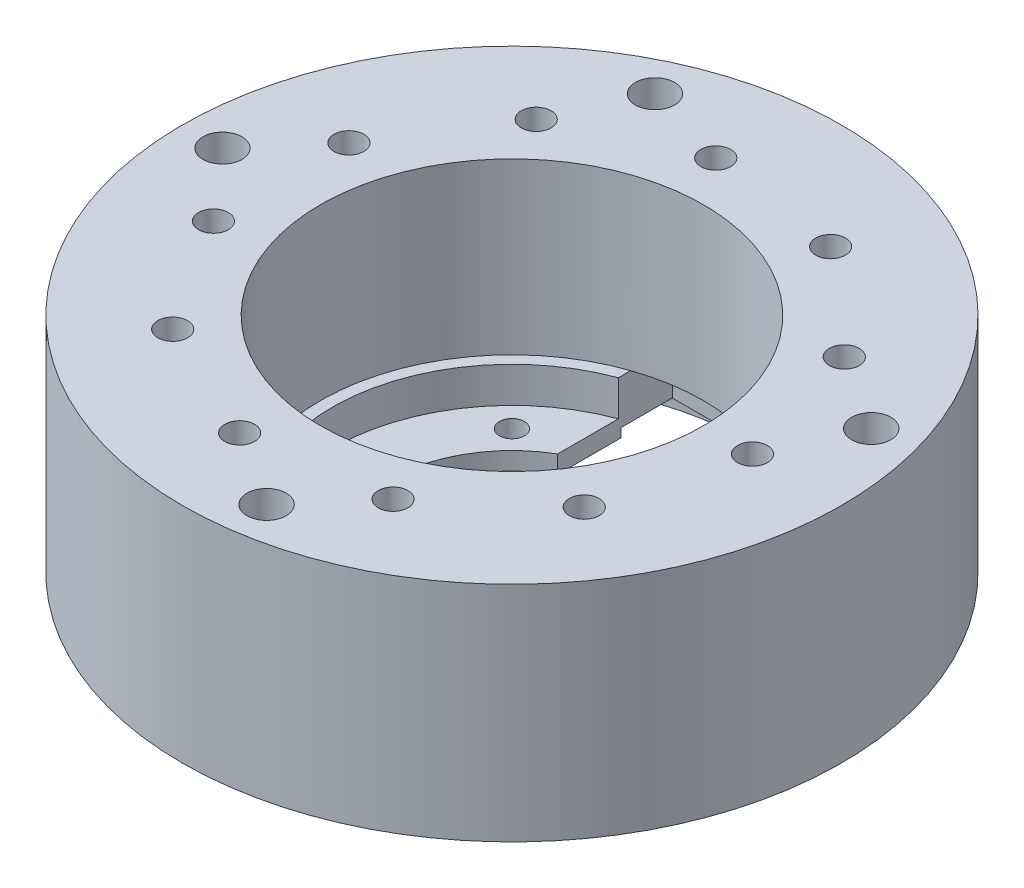
ISO-10303-21;
HEADER;
FILE_DESCRIPTION(('STEP AP214'),'2;1');
FILE_NAME('part.step','',(''),(''),'','','');
FILE_SCHEMA(('AUTOMOTIVE_DESIGN { 1 0 10303 214 1 1 1 1 }'));
ENDSEC;
DATA;
#1=APPLICATION_CONTEXT('core data for automotive mechanical design processes');
#2=APPLICATION_PROTOCOL_DEFINITION('international standard','automotive_design',2000,#1);
#3=PRODUCT_CONTEXT('',#1,'mechanical');
#4=PRODUCT('Part','Part','',(#3));
#5=PRODUCT_RELATED_PRODUCT_CATEGORY('part','',(#4));
#6=PRODUCT_DEFINITION_FORMATION('','',#4);
#7=PRODUCT_DEFINITION_CONTEXT('part definition',#1,'design');
#8=PRODUCT_DEFINITION('design','',#6,#7);
#9=PRODUCT_DEFINITION_SHAPE('','',#8);
#10=(LENGTH_UNIT() NAMED_UNIT(*) SI_UNIT(.MILLI.,.METRE.));
#11=(NAMED_UNIT(*) PLANE_ANGLE_UNIT() SI_UNIT($,.RADIAN.));
#12=(NAMED_UNIT(*) SI_UNIT($,.STERADIAN.) SOLID_ANGLE_UNIT());
#13=UNCERTAINTY_MEASURE_WITH_UNIT(LENGTH_MEASURE(1.E-05),#10,'distance_accuracy_value','');
#14=(GEOMETRIC_REPRESENTATION_CONTEXT(3) GLOBAL_UNCERTAINTY_ASSIGNED_CONTEXT((#13)) GLOBAL_UNIT_ASSIGNED_CONTEXT((#10,
#11,#12)) REPRESENTATION_CONTEXT('',''));
#15=CARTESIAN_POINT('',(0.,0.,0.));
#16=DIRECTION('',(0.,0.,1.));
#17=DIRECTION('',(1.,0.,0.));
#18=AXIS2_PLACEMENT_3D('',#15,#16,#17);
#19=CARTESIAN_POINT('',(0.,0.,0.));
#20=DIRECTION('',(0.,1.,0.));
#21=DIRECTION('',(0.,0.,1.));
#22=AXIS2_PLACEMENT_3D('',#19,#20,#21);
#23=PLANE('',#22);
#24=CARTESIAN_POINT('',(0.,0.,0.));
#25=DIRECTION('',(0.,1.,0.));
#26=DIRECTION('',(0.,0.,1.));
#27=AXIS2_PLACEMENT_3D('',#24,#25,#26);
#28=CIRCLE('',#27,20.5);
#29=CARTESIAN_POINT('',(-7.,0.,-19.2678488679977));
#30=VERTEX_POINT('',#29);
#31=CARTESIAN_POINT('',(7.,0.,-19.2678488679977));
#32=VERTEX_POINT('',#31);
#33=EDGE_CURVE('E109',#30,#32,#28,.T.);
#34=ORIENTED_EDGE('',*,*,#33,.F.);
#35=DIRECTION('',(0.,0.,1.));
#36=VECTOR('',#35,1.);
#37=CARTESIAN_POINT('',(-7.,0.,-11.));
#38=LINE('',#37,#36);
#39=CARTESIAN_POINT('',(-7.,0.,-12.1243556529821));
#40=VERTEX_POINT('',#39);
#41=EDGE_CURVE('E135',#30,#40,#38,.T.);
#42=ORIENTED_EDGE('',*,*,#41,.T.);
#43=CARTESIAN_POINT('',(0.,0.,0.));
#44=DIRECTION('',(0.,1.,0.));
#45=DIRECTION('',(0.,0.,1.));
#46=AXIS2_PLACEMENT_3D('',#43,#44,#45);
#47=CIRCLE('',#46,14.);
#48=CARTESIAN_POINT('',(7.,0.,-12.1243556529821));
#49=VERTEX_POINT('',#48);
#50=EDGE_CURVE('E131',#40,#49,#47,.T.);
#51=ORIENTED_EDGE('',*,*,#50,.T.);
#52=DIRECTION('',(0.,0.,-1.));
#53=VECTOR('',#52,1.);
#54=CARTESIAN_POINT('',(7.,0.,-11.));
#55=LINE('',#54,#53);
#56=EDGE_CURVE('E124',#49,#32,#55,.T.);
#57=ORIENTED_EDGE('',*,*,#56,.T.);
#58=EDGE_LOOP('',(#34,#42,#51,#57));
#59=FACE_BOUND('',#58,.T.);
#60=CARTESIAN_POINT('',(12.021,0.,-12.021));
#61=DIRECTION('',(0.,1.,0.));
#62=DIRECTION('',(0.,0.,1.));
#63=AXIS2_PLACEMENT_3D('',#60,#61,#62);
#64=CIRCLE('',#63,1.4);
#65=CARTESIAN_POINT('',(12.021,0.,-10.621));
#66=VERTEX_POINT('',#65);
#67=EDGE_CURVE('E212',#66,#66,#64,.T.);
#68=ORIENTED_EDGE('',*,*,#67,.T.);
#69=EDGE_LOOP('',(#68));
#70=FACE_BOUND('',#69,.T.);
#71=CARTESIAN_POINT('',(12.021,0.,12.021));
#72=DIRECTION('',(0.,1.,0.));
#73=DIRECTION('',(0.,0.,1.));
#74=AXIS2_PLACEMENT_3D('',#71,#72,#73);
#75=CIRCLE('',#74,1.4);
#76=CARTESIAN_POINT('',(12.021,0.,13.421));
#77=VERTEX_POINT('',#76);
#78=EDGE_CURVE('E211',#77,#77,#75,.T.);
#79=ORIENTED_EDGE('',*,*,#78,.T.);
#80=EDGE_LOOP('',(#79));
#81=FACE_BOUND('',#80,.T.);
#82=CARTESIAN_POINT('',(-12.0210000000001,0.,12.0209999999999));
#83=DIRECTION('',(0.,1.,0.));
#84=DIRECTION('',(0.,0.,1.));
#85=AXIS2_PLACEMENT_3D('',#82,#83,#84);
#86=CIRCLE('',#85,1.4);
#87=CARTESIAN_POINT('',(-12.0210000000001,0.,13.4209999999999));
#88=VERTEX_POINT('',#87);
#89=EDGE_CURVE('E218',#88,#88,#86,.T.);
#90=ORIENTED_EDGE('',*,*,#89,.T.);
#91=EDGE_LOOP('',(#90));
#92=FACE_BOUND('',#91,.T.);
#93=CARTESIAN_POINT('',(-12.0209999999999,0.,-12.0210000000001));
#94=DIRECTION('',(0.,1.,0.));
#95=DIRECTION('',(0.,0.,1.));
#96=AXIS2_PLACEMENT_3D('',#93,#94,#95);
#97=CIRCLE('',#96,1.4);
#98=CARTESIAN_POINT('',(-12.0209999999999,0.,-10.6210000000001));
#99=VERTEX_POINT('',#98);
#100=EDGE_CURVE('E213',#99,#99,#97,.T.);
#101=ORIENTED_EDGE('',*,*,#100,.T.);
#102=EDGE_LOOP('',(#101));
#103=FACE_BOUND('',#102,.T.);
#104=ADVANCED_FACE('F39',(#59,#70,#81,#92,#103),#23,.F.);
#105=CARTESIAN_POINT('',(0.,2.,0.));
#106=DIRECTION('',(0.,1.,0.));
#107=DIRECTION('',(0.,0.,1.));
#108=AXIS2_PLACEMENT_3D('',#105,#106,#107);
#109=CYLINDRICAL_SURFACE('',#108,20.2);
#110=DIRECTION('',(0.,1.,0.));
#111=VECTOR('',#110,1.);
#112=CARTESIAN_POINT('',(7.,2.,-18.9483508517232));
#113=LINE('',#112,#111);
#114=CARTESIAN_POINT('',(7.,2.,-18.9483508517232));
#115=VERTEX_POINT('',#114);
#116=CARTESIAN_POINT('',(7.,6.,-18.9483508517232));
#117=VERTEX_POINT('',#116);
#118=EDGE_CURVE('E154',#115,#117,#113,.T.);
#119=ORIENTED_EDGE('',*,*,#118,.F.);
#120=CARTESIAN_POINT('',(0.,2.,0.));
#121=DIRECTION('',(0.,1.,0.));
#122=DIRECTION('',(0.,0.,1.));
#123=AXIS2_PLACEMENT_3D('',#120,#121,#122);
#124=CIRCLE('',#123,20.2);
#125=CARTESIAN_POINT('',(-7.,2.,-18.9483508517232));
#126=VERTEX_POINT('',#125);
#127=EDGE_CURVE('E162',#126,#115,#124,.T.);
#128=ORIENTED_EDGE('',*,*,#127,.F.);
#129=DIRECTION('',(0.,1.,0.));
#130=VECTOR('',#129,1.);
#131=CARTESIAN_POINT('',(-7.,2.,-18.9483508517232));
#132=LINE('',#131,#130);
#133=CARTESIAN_POINT('',(-7.,6.,-18.9483508517232));
#134=VERTEX_POINT('',#133);
#135=EDGE_CURVE('E148',#134,#126,#132,.F.);
#136=ORIENTED_EDGE('',*,*,#135,.F.);
#137=CARTESIAN_POINT('',(0.,6.,0.));
#138=DIRECTION('',(0.,1.,0.));
#139=DIRECTION('',(0.,0.,1.));
#140=AXIS2_PLACEMENT_3D('',#137,#138,#139);
#141=CIRCLE('',#140,20.2);
#142=EDGE_CURVE('E159',#134,#117,#141,.T.);
#143=ORIENTED_EDGE('',*,*,#142,.T.);
#144=EDGE_LOOP('',(#119,#128,#136,#143));
#145=FACE_BOUND('',#144,.T.);
#146=ADVANCED_FACE('F337',(#145),#109,.F.);
#147=CARTESIAN_POINT('',(0.,2.,0.));
#148=DIRECTION('',(0.,1.,0.));
#149=DIRECTION('',(0.,0.,1.));
#150=AXIS2_PLACEMENT_3D('',#147,#148,#149);
#151=PLANE('',#150);
#152=CARTESIAN_POINT('',(-12.0209999999999,2.,-12.0210000000001));
#153=DIRECTION('',(0.,1.,0.));
#154=DIRECTION('',(0.,0.,1.));
#155=AXIS2_PLACEMENT_3D('',#152,#153,#154);
#156=CIRCLE('',#155,1.4);
#157=CARTESIAN_POINT('',(-12.0209999999999,2.,-10.6210000000001));
#158=VERTEX_POINT('',#157);
#159=EDGE_CURVE('E133',#158,#158,#156,.F.);
#160=ORIENTED_EDGE('',*,*,#159,.T.);
#161=EDGE_LOOP('',(#160));
#162=FACE_BOUND('',#161,.T.);
#163=CARTESIAN_POINT('',(-12.0210000000001,2.,12.0209999999999));
#164=DIRECTION('',(0.,1.,0.));
#165=DIRECTION('',(0.,0.,1.));
#166=AXIS2_PLACEMENT_3D('',#163,#164,#165);
#167=CIRCLE('',#166,1.4);
#168=CARTESIAN_POINT('',(-12.0210000000001,2.,13.4209999999999));
#169=VERTEX_POINT('',#168);
#170=EDGE_CURVE('E136',#169,#169,#167,.F.);
#171=ORIENTED_EDGE('',*,*,#170,.T.);
#172=EDGE_LOOP('',(#171));
#173=FACE_BOUND('',#172,.T.);
#174=CARTESIAN_POINT('',(12.021,2.,12.021));
#175=DIRECTION('',(0.,1.,0.));
#176=DIRECTION('',(0.,0.,1.));
#177=AXIS2_PLACEMENT_3D('',#174,#175,#176);
#178=CIRCLE('',#177,1.4);
#179=CARTESIAN_POINT('',(12.021,2.,13.421));
#180=VERTEX_POINT('',#179);
#181=EDGE_CURVE('E202',#180,#180,#178,.F.);
#182=ORIENTED_EDGE('',*,*,#181,.T.);
#183=EDGE_LOOP('',(#182));
#184=FACE_BOUND('',#183,.T.);
#185=CARTESIAN_POINT('',(12.021,2.,-12.021));
#186=DIRECTION('',(0.,1.,0.));
#187=DIRECTION('',(0.,0.,1.));
#188=AXIS2_PLACEMENT_3D('',#185,#186,#187);
#189=CIRCLE('',#188,1.4);
#190=CARTESIAN_POINT('',(12.021,2.,-10.621));
#191=VERTEX_POINT('',#190);
#192=EDGE_CURVE('E206',#191,#191,#189,.F.);
#193=ORIENTED_EDGE('',*,*,#192,.T.);
#194=EDGE_LOOP('',(#193));
#195=FACE_BOUND('',#194,.T.);
#196=ORIENTED_EDGE('',*,*,#127,.T.);
#197=DIRECTION('',(0.,0.,1.));
#198=VECTOR('',#197,1.);
#199=CARTESIAN_POINT('',(7.00000000000001,2.,0.));
#200=LINE('',#199,#198);
#201=CARTESIAN_POINT('',(7.,2.,-12.1243556529821));
#202=VERTEX_POINT('',#201);
#203=EDGE_CURVE('E155',#115,#202,#200,.T.);
#204=ORIENTED_EDGE('',*,*,#203,.T.);
#205=CARTESIAN_POINT('',(0.,2.,0.));
#206=DIRECTION('',(0.,1.,0.));
#207=DIRECTION('',(0.,0.,1.));
#208=AXIS2_PLACEMENT_3D('',#205,#206,#207);
#209=CIRCLE('',#208,14.);
#210=CARTESIAN_POINT('',(-7.,2.,-12.1243556529821));
#211=VERTEX_POINT('',#210);
#212=EDGE_CURVE('E160',#211,#202,#209,.T.);
#213=ORIENTED_EDGE('',*,*,#212,.F.);
#214=DIRECTION('',(0.,0.,-1.));
#215=VECTOR('',#214,1.);
#216=CARTESIAN_POINT('',(-6.99999999999999,2.,0.));
#217=LINE('',#216,#215);
#218=EDGE_CURVE('E65',#211,#126,#217,.T.);
#219=ORIENTED_EDGE('',*,*,#218,.T.);
#220=EDGE_LOOP('',(#196,#204,#213,#219));
#221=FACE_BOUND('',#220,.T.);
#222=ADVANCED_FACE('F345',(#162,#173,#184,#195,#221),#151,.T.);
#223=CARTESIAN_POINT('',(0.,0.,0.));
#224=DIRECTION('',(0.,1.,0.));
#225=DIRECTION('',(0.,0.,1.));
#226=AXIS2_PLACEMENT_3D('',#223,#224,#225);
#227=CYLINDRICAL_SURFACE('',#226,14.);
#228=DIRECTION('',(0.,1.,0.));
#229=VECTOR('',#228,1.);
#230=CARTESIAN_POINT('',(7.,0.,-12.1243556529821));
#231=LINE('',#230,#229);
#232=EDGE_CURVE('E181',#49,#202,#231,.T.);
#233=ORIENTED_EDGE('',*,*,#232,.F.);
#234=ORIENTED_EDGE('',*,*,#50,.F.);
#235=DIRECTION('',(0.,1.,0.));
#236=VECTOR('',#235,1.);
#237=CARTESIAN_POINT('',(-7.,0.,-12.1243556529821));
#238=LINE('',#237,#236);
#239=EDGE_CURVE('E180',#211,#40,#238,.F.);
#240=ORIENTED_EDGE('',*,*,#239,.F.);
#241=ORIENTED_EDGE('',*,*,#212,.T.);
#242=EDGE_LOOP('',(#233,#234,#240,#241));
#243=FACE_BOUND('',#242,.T.);
#244=ADVANCED_FACE('F361',(#243),#227,.F.);
#245=CARTESIAN_POINT('',(0.,25.05,0.));
#246=DIRECTION('',(0.,-1.,0.));
#247=DIRECTION('',(0.,0.,-1.));
#248=AXIS2_PLACEMENT_3D('',#245,#246,#247);
#249=CYLINDRICAL_SURFACE('',#248,37.);
#250=CARTESIAN_POINT('',(0.,25.05,0.));
#251=DIRECTION('',(0.,1.,0.));
#252=DIRECTION('',(0.,0.,1.));
#253=AXIS2_PLACEMENT_3D('',#250,#251,#252);
#254=CIRCLE('',#253,37.);
#255=CARTESIAN_POINT('',(0.,25.05,37.));
#256=VERTEX_POINT('',#255);
#257=EDGE_CURVE('E172',#256,#256,#254,.T.);
#258=ORIENTED_EDGE('',*,*,#257,.F.);
#259=EDGE_LOOP('',(#258));
#260=FACE_BOUND('',#259,.T.);
#261=CARTESIAN_POINT('',(0.,0.,0.));
#262=DIRECTION('',(0.,1.,0.));
#263=DIRECTION('',(0.,0.,1.));
#264=AXIS2_PLACEMENT_3D('',#261,#262,#263);
#265=CIRCLE('',#264,37.);
#266=CARTESIAN_POINT('',(0.,0.,37.));
#267=VERTEX_POINT('',#266);
#268=EDGE_CURVE('E167',#267,#267,#265,.T.);
#269=ORIENTED_EDGE('',*,*,#268,.T.);
#270=EDGE_LOOP('',(#269));
#271=FACE_BOUND('',#270,.T.);
#272=ADVANCED_FACE('F41',(#260,#271),#249,.T.);
#273=CARTESIAN_POINT('',(0.,25.05,0.));
#274=DIRECTION('',(0.,1.,0.));
#275=DIRECTION('',(0.,0.,1.));
#276=AXIS2_PLACEMENT_3D('',#273,#274,#275);
#277=PLANE('',#276);
#278=CARTESIAN_POINT('',(31.1841026986622,25.05,-9.15432896936147));
#279=DIRECTION('',(0.,1.,0.));
#280=DIRECTION('',(0.,0.,1.));
#281=AXIS2_PLACEMENT_3D('',#278,#279,#280);
#282=CIRCLE('',#281,2.2);
#283=CARTESIAN_POINT('',(31.1841026986622,25.05,-6.95432896936147));
#284=VERTEX_POINT('',#283);
#285=EDGE_CURVE('E310',#284,#284,#282,.T.);
#286=ORIENTED_EDGE('',*,*,#285,.F.);
#287=EDGE_LOOP('',(#286));
#288=FACE_BOUND('',#287,.T.);
#289=CARTESIAN_POINT('',(-13.5033332090834,25.05,-29.5619686801212));
#290=DIRECTION('',(0.,1.,0.));
#291=DIRECTION('',(0.,0.,1.));
#292=AXIS2_PLACEMENT_3D('',#289,#290,#291);
#293=CIRCLE('',#292,2.2);
#294=CARTESIAN_POINT('',(-13.5033332090834,25.05,-27.3619686801212));
#295=VERTEX_POINT('',#294);
#296=EDGE_CURVE('E302',#295,#295,#293,.T.);
#297=ORIENTED_EDGE('',*,*,#296,.F.);
#298=EDGE_LOOP('',(#297));
#299=FACE_BOUND('',#298,.T.);
#300=CARTESIAN_POINT('',(-32.5,25.05,2.34906491219261E-13));
#301=DIRECTION('',(0.,1.,0.));
#302=DIRECTION('',(0.,0.,1.));
#303=AXIS2_PLACEMENT_3D('',#300,#301,#302);
#304=CIRCLE('',#303,2.2);
#305=CARTESIAN_POINT('',(-32.5,25.05,2.20000000000024));
#306=VERTEX_POINT('',#305);
#307=EDGE_CURVE('E296',#306,#306,#304,.T.);
#308=ORIENTED_EDGE('',*,*,#307,.F.);
#309=EDGE_LOOP('',(#308));
#310=FACE_BOUND('',#309,.T.);
#311=CARTESIAN_POINT('',(4.62421140809311,25.05,32.1693436186264));
#312=DIRECTION('',(0.,1.,0.));
#313=DIRECTION('',(0.,0.,1.));
#314=AXIS2_PLACEMENT_3D('',#311,#312,#313);
#315=CIRCLE('',#314,2.2);
#316=CARTESIAN_POINT('',(4.62421140809311,25.05,34.3693436186264));
#317=VERTEX_POINT('',#316);
#318=EDGE_CURVE('E292',#317,#317,#315,.T.);
#319=ORIENTED_EDGE('',*,*,#318,.F.);
#320=EDGE_LOOP('',(#319));
#321=FACE_BOUND('',#320,.T.);
#322=CARTESIAN_POINT('',(27.,25.05,0.));
#323=DIRECTION('',(0.,1.,0.));
#324=DIRECTION('',(0.,0.,1.));
#325=AXIS2_PLACEMENT_3D('',#322,#323,#324);
#326=CIRCLE('',#325,1.675);
#327=CARTESIAN_POINT('',(27.,25.05,1.675));
#328=VERTEX_POINT('',#327);
#329=EDGE_CURVE('E271',#328,#328,#326,.T.);
#330=ORIENTED_EDGE('',*,*,#329,.F.);
#331=EDGE_LOOP('',(#330));
#332=FACE_BOUND('',#331,.T.);
#333=CARTESIAN_POINT('',(22.7138453864421,25.05,-14.5973020713008));
#334=DIRECTION('',(0.,1.,0.));
#335=DIRECTION('',(0.,0.,1.));
#336=AXIS2_PLACEMENT_3D('',#333,#334,#335);
#337=CIRCLE('',#336,1.675);
#338=CARTESIAN_POINT('',(22.7138453864421,25.05,-12.9223020713008));
#339=VERTEX_POINT('',#338);
#340=EDGE_CURVE('E280',#339,#339,#337,.T.);
#341=ORIENTED_EDGE('',*,*,#340,.F.);
#342=EDGE_LOOP('',(#341));
#343=FACE_BOUND('',#342,.T.);
#344=CARTESIAN_POINT('',(11.2162053510512,25.05,-24.5600638745719));
#345=DIRECTION('',(0.,1.,0.));
#346=DIRECTION('',(0.,0.,1.));
#347=AXIS2_PLACEMENT_3D('',#344,#345,#346);
#348=CIRCLE('',#347,1.675);
#349=CARTESIAN_POINT('',(11.2162053510512,25.05,-22.8850638745719));
#350=VERTEX_POINT('',#349);
#351=EDGE_CURVE('E226',#350,#350,#348,.T.);
#352=ORIENTED_EDGE('',*,*,#351,.F.);
#353=EDGE_LOOP('',(#352));
#354=FACE_BOUND('',#353,.T.);
#355=CARTESIAN_POINT('',(-3.84250063337842,25.05,-26.7251789307852));
#356=DIRECTION('',(0.,1.,0.));
#357=DIRECTION('',(0.,0.,1.));
#358=AXIS2_PLACEMENT_3D('',#355,#356,#357);
#359=CIRCLE('',#358,1.675);
#360=CARTESIAN_POINT('',(-3.84250063337842,25.05,-25.0501789307852));
#361=VERTEX_POINT('',#360);
#362=EDGE_CURVE('E227',#361,#361,#359,.T.);
#363=ORIENTED_EDGE('',*,*,#362,.F.);
#364=EDGE_LOOP('',(#363));
#365=FACE_BOUND('',#364,.T.);
#366=CARTESIAN_POINT('',(-17.6812398165225,25.05,-20.4052385075651));
#367=DIRECTION('',(0.,1.,0.));
#368=DIRECTION('',(0.,0.,1.));
#369=AXIS2_PLACEMENT_3D('',#366,#367,#368);
#370=CIRCLE('',#369,1.675);
#371=CARTESIAN_POINT('',(-17.6812398165225,25.05,-18.7302385075651));
#372=VERTEX_POINT('',#371);
#373=EDGE_CURVE('E234',#372,#372,#370,.T.);
#374=ORIENTED_EDGE('',*,*,#373,.F.);
#375=EDGE_LOOP('',(#374));
#376=FACE_BOUND('',#375,.T.);
#377=CARTESIAN_POINT('',(-25.9063102875914,25.05,-7.6067790347188));
#378=DIRECTION('',(0.,1.,0.));
#379=DIRECTION('',(0.,0.,1.));
#380=AXIS2_PLACEMENT_3D('',#377,#378,#379);
#381=CIRCLE('',#380,1.675);
#382=CARTESIAN_POINT('',(-25.9063102875914,25.05,-5.9317790347188));
#383=VERTEX_POINT('',#382);
#384=EDGE_CURVE('E239',#383,#383,#381,.T.);
#385=ORIENTED_EDGE('',*,*,#384,.F.);
#386=EDGE_LOOP('',(#385));
#387=FACE_BOUND('',#386,.T.);
#388=CARTESIAN_POINT('',(-25.9063102875915,25.05,7.60677903471843));
#389=DIRECTION('',(0.,1.,0.));
#390=DIRECTION('',(0.,0.,1.));
#391=AXIS2_PLACEMENT_3D('',#388,#389,#390);
#392=CIRCLE('',#391,1.675);
#393=CARTESIAN_POINT('',(-25.9063102875915,25.05,9.28177903471843));
#394=VERTEX_POINT('',#393);
#395=EDGE_CURVE('E246',#394,#394,#392,.T.);
#396=ORIENTED_EDGE('',*,*,#395,.F.);
#397=EDGE_LOOP('',(#396));
#398=FACE_BOUND('',#397,.T.);
#399=CARTESIAN_POINT('',(-17.6812398165228,25.05,20.4052385075649));
#400=DIRECTION('',(0.,1.,0.));
#401=DIRECTION('',(0.,0.,1.));
#402=AXIS2_PLACEMENT_3D('',#399,#400,#401);
#403=CIRCLE('',#402,1.675);
#404=CARTESIAN_POINT('',(-17.6812398165228,25.05,22.0802385075649));
#405=VERTEX_POINT('',#404);
#406=EDGE_CURVE('E255',#405,#405,#403,.T.);
#407=ORIENTED_EDGE('',*,*,#406,.F.);
#408=EDGE_LOOP('',(#407));
#409=FACE_BOUND('',#408,.T.);
#410=CARTESIAN_POINT('',(-3.8425006333788,25.05,26.7251789307852));
#411=DIRECTION('',(0.,1.,0.));
#412=DIRECTION('',(0.,0.,1.));
#413=AXIS2_PLACEMENT_3D('',#410,#411,#412);
#414=CIRCLE('',#413,1.675);
#415=CARTESIAN_POINT('',(-3.8425006333788,25.05,28.4001789307852));
#416=VERTEX_POINT('',#415);
#417=EDGE_CURVE('E259',#416,#416,#414,.T.);
#418=ORIENTED_EDGE('',*,*,#417,.F.);
#419=EDGE_LOOP('',(#418));
#420=FACE_BOUND('',#419,.T.);
#421=CARTESIAN_POINT('',(11.2162053510509,25.05,24.560063874572));
#422=DIRECTION('',(0.,1.,0.));
#423=DIRECTION('',(0.,0.,1.));
#424=AXIS2_PLACEMENT_3D('',#421,#422,#423);
#425=CIRCLE('',#424,1.675);
#426=CARTESIAN_POINT('',(11.2162053510509,25.05,26.235063874572));
#427=VERTEX_POINT('',#426);
#428=EDGE_CURVE('E262',#427,#427,#425,.T.);
#429=ORIENTED_EDGE('',*,*,#428,.F.);
#430=EDGE_LOOP('',(#429));
#431=FACE_BOUND('',#430,.T.);
#432=CARTESIAN_POINT('',(22.7138453864419,25.05,14.5973020713012));
#433=DIRECTION('',(0.,1.,0.));
#434=DIRECTION('',(0.,0.,1.));
#435=AXIS2_PLACEMENT_3D('',#432,#433,#434);
#436=CIRCLE('',#435,1.675);
#437=CARTESIAN_POINT('',(22.7138453864419,25.05,16.2723020713012));
#438=VERTEX_POINT('',#437);
#439=EDGE_CURVE('E267',#438,#438,#436,.T.);
#440=ORIENTED_EDGE('',*,*,#439,.F.);
#441=EDGE_LOOP('',(#440));
#442=FACE_BOUND('',#441,.T.);
#443=CARTESIAN_POINT('',(0.,25.05,0.));
#444=DIRECTION('',(0.,1.,0.));
#445=DIRECTION('',(0.,0.,1.));
#446=AXIS2_PLACEMENT_3D('',#443,#444,#445);
#447=CIRCLE('',#446,21.5);
#448=CARTESIAN_POINT('',(0.,25.05,21.5));
#449=VERTEX_POINT('',#448);
#450=EDGE_CURVE('E164',#449,#449,#447,.T.);
#451=ORIENTED_EDGE('',*,*,#450,.F.);
#452=EDGE_LOOP('',(#451));
#453=FACE_BOUND('',#452,.T.);
#454=ORIENTED_EDGE('',*,*,#257,.T.);
#455=EDGE_LOOP('',(#454));
#456=FACE_BOUND('',#455,.T.);
#457=ADVANCED_FACE('F350',(#288,#299,#310,#321,#332,#343,#354,#365,#376,#387,#398,#409,#420,
#431,#442,#453,#456),#277,.T.);
#458=CARTESIAN_POINT('',(0.,0.,0.));
#459=DIRECTION('',(0.,1.,0.));
#460=DIRECTION('',(0.,0.,1.));
#461=AXIS2_PLACEMENT_3D('',#458,#459,#460);
#462=CIRCLE('',#461,26.);
#463=CARTESIAN_POINT('',(0.,0.,26.));
#464=VERTEX_POINT('',#463);
#465=EDGE_CURVE('E312',#464,#464,#462,.T.);
#466=ORIENTED_EDGE('',*,*,#465,.T.);
#467=EDGE_LOOP('',(#466));
#468=FACE_BOUND('',#467,.T.);
#469=ORIENTED_EDGE('',*,*,#268,.F.);
#470=EDGE_LOOP('',(#469));
#471=FACE_BOUND('',#470,.T.);
#472=ADVANCED_FACE('F340',(#468,#471),#23,.F.);
#473=CARTESIAN_POINT('',(0.,6.,0.));
#474=DIRECTION('',(0.,1.,0.));
#475=DIRECTION('',(0.,0.,1.));
#476=AXIS2_PLACEMENT_3D('',#473,#474,#475);
#477=CYLINDRICAL_SURFACE('',#476,21.5);
#478=CARTESIAN_POINT('',(0.,6.,0.));
#479=DIRECTION('',(0.,1.,0.));
#480=DIRECTION('',(0.,0.,1.));
#481=AXIS2_PLACEMENT_3D('',#478,#479,#480);
#482=CIRCLE('',#481,21.5);
#483=CARTESIAN_POINT('',(7.,6.,-20.3285513502561));
#484=VERTEX_POINT('',#483);
#485=CARTESIAN_POINT('',(-7.,6.,-20.3285513502561));
#486=VERTEX_POINT('',#485);
#487=EDGE_CURVE('E166',#484,#486,#482,.T.);
#488=ORIENTED_EDGE('',*,*,#487,.F.);
#489=EDGE_CURVE('E171',#486,#484,#482,.T.);
#490=ORIENTED_EDGE('',*,*,#489,.F.);
#491=EDGE_LOOP('',(#488,#490));
#492=FACE_BOUND('',#491,.T.);
#493=ORIENTED_EDGE('',*,*,#450,.T.);
#494=EDGE_LOOP('',(#493));
#495=FACE_BOUND('',#494,.T.);
#496=ADVANCED_FACE('F346',(#492,#495),#477,.F.);
#497=CARTESIAN_POINT('',(0.,6.,0.));
#498=DIRECTION('',(0.,1.,0.));
#499=DIRECTION('',(0.,0.,1.));
#500=AXIS2_PLACEMENT_3D('',#497,#498,#499);
#501=PLANE('',#500);
#502=DIRECTION('',(0.,0.,-1.));
#503=VECTOR('',#502,1.);
#504=CARTESIAN_POINT('',(7.,6.,-11.));
#505=LINE('',#504,#503);
#506=EDGE_CURVE('E197',#117,#484,#505,.T.);
#507=ORIENTED_EDGE('',*,*,#506,.F.);
#508=ORIENTED_EDGE('',*,*,#142,.F.);
#509=DIRECTION('',(0.,0.,1.));
#510=VECTOR('',#509,1.);
#511=CARTESIAN_POINT('',(-7.,6.,-11.));
#512=LINE('',#511,#510);
#513=EDGE_CURVE('E198',#486,#134,#512,.T.);
#514=ORIENTED_EDGE('',*,*,#513,.F.);
#515=ORIENTED_EDGE('',*,*,#489,.T.);
#516=EDGE_LOOP('',(#507,#508,#514,#515));
#517=FACE_BOUND('',#516,.T.);
#518=ADVANCED_FACE('F351',(#517),#501,.T.);
#519=CARTESIAN_POINT('',(0.,6.,0.));
#520=DIRECTION('',(0.,-1.,0.));
#521=DIRECTION('',(0.,0.,-1.));
#522=AXIS2_PLACEMENT_3D('',#519,#520,#521);
#523=PLANE('',#522);
#524=ORIENTED_EDGE('',*,*,#487,.T.);
#525=CARTESIAN_POINT('',(-7.,6.,-25.));
#526=VERTEX_POINT('',#525);
#527=EDGE_CURVE('E142',#526,#486,#512,.T.);
#528=ORIENTED_EDGE('',*,*,#527,.F.);
#529=DIRECTION('',(-1.,0.,0.));
#530=VECTOR('',#529,1.);
#531=CARTESIAN_POINT('',(-7.,6.,-25.));
#532=LINE('',#531,#530);
#533=CARTESIAN_POINT('',(7.,6.,-25.));
#534=VERTEX_POINT('',#533);
#535=EDGE_CURVE('E196',#534,#526,#532,.T.);
#536=ORIENTED_EDGE('',*,*,#535,.F.);
#537=EDGE_CURVE('E134',#484,#534,#505,.T.);
#538=ORIENTED_EDGE('',*,*,#537,.F.);
#539=EDGE_LOOP('',(#524,#528,#536,#538));
#540=FACE_BOUND('',#539,.T.);
#541=ADVANCED_FACE('F382',(#540),#523,.T.);
#542=CARTESIAN_POINT('',(7.,6.,-11.));
#543=DIRECTION('',(-1.,0.,0.));
#544=DIRECTION('',(0.,0.,1.));
#545=AXIS2_PLACEMENT_3D('',#542,#543,#544);
#546=PLANE('',#545);
#547=DIRECTION('',(0.,0.,-1.));
#548=VECTOR('',#547,1.);
#549=CARTESIAN_POINT('',(7.,1.,-11.));
#550=LINE('',#549,#548);
#551=CARTESIAN_POINT('',(7.,1.,-19.2678488679977));
#552=VERTEX_POINT('',#551);
#553=CARTESIAN_POINT('',(7.,1.,-25.));
#554=VERTEX_POINT('',#553);
#555=EDGE_CURVE('E53',#552,#554,#550,.T.);
#556=ORIENTED_EDGE('',*,*,#555,.F.);
#557=DIRECTION('',(0.,-1.,0.));
#558=VECTOR('',#557,1.);
#559=CARTESIAN_POINT('',(7.,1.,-19.2678488679977));
#560=LINE('',#559,#558);
#561=EDGE_CURVE('E112',#32,#552,#560,.F.);
#562=ORIENTED_EDGE('',*,*,#561,.F.);
#563=ORIENTED_EDGE('',*,*,#56,.F.);
#564=ORIENTED_EDGE('',*,*,#232,.T.);
#565=ORIENTED_EDGE('',*,*,#203,.F.);
#566=ORIENTED_EDGE('',*,*,#118,.T.);
#567=ORIENTED_EDGE('',*,*,#506,.T.);
#568=ORIENTED_EDGE('',*,*,#537,.T.);
#569=DIRECTION('',(0.,-1.,0.));
#570=VECTOR('',#569,1.);
#571=CARTESIAN_POINT('',(7.,6.,-25.));
#572=LINE('',#571,#570);
#573=EDGE_CURVE('E150',#534,#554,#572,.T.);
#574=ORIENTED_EDGE('',*,*,#573,.T.);
#575=EDGE_LOOP('',(#556,#562,#563,#564,#565,#566,#567,#568,#574));
#576=FACE_BOUND('',#575,.T.);
#577=ADVANCED_FACE('F125',(#576),#546,.T.);
#578=CARTESIAN_POINT('',(-7.,6.,-11.));
#579=DIRECTION('',(1.,0.,0.));
#580=DIRECTION('',(0.,0.,-1.));
#581=AXIS2_PLACEMENT_3D('',#578,#579,#580);
#582=PLANE('',#581);
#583=DIRECTION('',(0.,0.,1.));
#584=VECTOR('',#583,1.);
#585=CARTESIAN_POINT('',(-7.,1.,-11.));
#586=LINE('',#585,#584);
#587=CARTESIAN_POINT('',(-7.,1.,-25.));
#588=VERTEX_POINT('',#587);
#589=CARTESIAN_POINT('',(-7.,1.,-19.2678488679977));
#590=VERTEX_POINT('',#589);
#591=EDGE_CURVE('E184',#588,#590,#586,.T.);
#592=ORIENTED_EDGE('',*,*,#591,.F.);
#593=DIRECTION('',(0.,-1.,0.));
#594=VECTOR('',#593,1.);
#595=CARTESIAN_POINT('',(-7.,6.,-25.));
#596=LINE('',#595,#594);
#597=EDGE_CURVE('E144',#526,#588,#596,.T.);
#598=ORIENTED_EDGE('',*,*,#597,.F.);
#599=ORIENTED_EDGE('',*,*,#527,.T.);
#600=ORIENTED_EDGE('',*,*,#513,.T.);
#601=ORIENTED_EDGE('',*,*,#135,.T.);
#602=ORIENTED_EDGE('',*,*,#218,.F.);
#603=ORIENTED_EDGE('',*,*,#239,.T.);
#604=ORIENTED_EDGE('',*,*,#41,.F.);
#605=DIRECTION('',(0.,-1.,0.));
#606=VECTOR('',#605,1.);
#607=CARTESIAN_POINT('',(-7.,1.,-19.2678488679977));
#608=LINE('',#607,#606);
#609=EDGE_CURVE('E11',#590,#30,#608,.T.);
#610=ORIENTED_EDGE('',*,*,#609,.F.);
#611=EDGE_LOOP('',(#592,#598,#599,#600,#601,#602,#603,#604,#610));
#612=FACE_BOUND('',#611,.T.);
#613=ADVANCED_FACE('F186',(#612),#582,.T.);
#614=CARTESIAN_POINT('',(-7.,6.,-25.));
#615=DIRECTION('',(0.,0.,1.));
#616=DIRECTION('',(1.,0.,0.));
#617=AXIS2_PLACEMENT_3D('',#614,#615,#616);
#618=PLANE('',#617);
#619=DIRECTION('',(-1.,0.,0.));
#620=VECTOR('',#619,1.);
#621=CARTESIAN_POINT('',(-7.,1.,-25.));
#622=LINE('',#621,#620);
#623=EDGE_CURVE('E50',#554,#588,#622,.T.);
#624=ORIENTED_EDGE('',*,*,#623,.F.);
#625=ORIENTED_EDGE('',*,*,#573,.F.);
#626=ORIENTED_EDGE('',*,*,#535,.T.);
#627=ORIENTED_EDGE('',*,*,#597,.T.);
#628=EDGE_LOOP('',(#624,#625,#626,#627));
#629=FACE_BOUND('',#628,.T.);
#630=ADVANCED_FACE('F191',(#629),#618,.T.);
#631=CARTESIAN_POINT('',(12.021,25.05,-12.021));
#632=DIRECTION('',(0.,-1.,0.));
#633=DIRECTION('',(0.,0.,-1.));
#634=AXIS2_PLACEMENT_3D('',#631,#632,#633);
#635=CYLINDRICAL_SURFACE('',#634,1.4);
#636=ORIENTED_EDGE('',*,*,#192,.F.);
#637=EDGE_LOOP('',(#636));
#638=FACE_BOUND('',#637,.T.);
#639=ORIENTED_EDGE('',*,*,#67,.F.);
#640=EDGE_LOOP('',(#639));
#641=FACE_BOUND('',#640,.T.);
#642=ADVANCED_FACE('F403',(#638,#641),#635,.F.);
#643=CARTESIAN_POINT('',(12.021,25.05,12.021));
#644=DIRECTION('',(0.,-1.,0.));
#645=DIRECTION('',(0.,0.,-1.));
#646=AXIS2_PLACEMENT_3D('',#643,#644,#645);
#647=CYLINDRICAL_SURFACE('',#646,1.4);
#648=ORIENTED_EDGE('',*,*,#181,.F.);
#649=EDGE_LOOP('',(#648));
#650=FACE_BOUND('',#649,.T.);
#651=ORIENTED_EDGE('',*,*,#78,.F.);
#652=EDGE_LOOP('',(#651));
#653=FACE_BOUND('',#652,.T.);
#654=ADVANCED_FACE('F411',(#650,#653),#647,.F.);
#655=CARTESIAN_POINT('',(-12.0210000000001,25.05,12.0209999999999));
#656=DIRECTION('',(0.,-1.,0.));
#657=DIRECTION('',(0.,0.,-1.));
#658=AXIS2_PLACEMENT_3D('',#655,#656,#657);
#659=CYLINDRICAL_SURFACE('',#658,1.4);
#660=ORIENTED_EDGE('',*,*,#170,.F.);
#661=EDGE_LOOP('',(#660));
#662=FACE_BOUND('',#661,.T.);
#663=ORIENTED_EDGE('',*,*,#89,.F.);
#664=EDGE_LOOP('',(#663));
#665=FACE_BOUND('',#664,.T.);
#666=ADVANCED_FACE('F418',(#662,#665),#659,.F.);
#667=CARTESIAN_POINT('',(-12.0209999999999,25.05,-12.0210000000001));
#668=DIRECTION('',(0.,-1.,0.));
#669=DIRECTION('',(0.,0.,-1.));
#670=AXIS2_PLACEMENT_3D('',#667,#668,#669);
#671=CYLINDRICAL_SURFACE('',#670,1.4);
#672=ORIENTED_EDGE('',*,*,#159,.F.);
#673=EDGE_LOOP('',(#672));
#674=FACE_BOUND('',#673,.T.);
#675=ORIENTED_EDGE('',*,*,#100,.F.);
#676=EDGE_LOOP('',(#675));
#677=FACE_BOUND('',#676,.T.);
#678=ADVANCED_FACE('F429',(#674,#677),#671,.F.);
#679=CARTESIAN_POINT('',(22.7138453864419,20.3,14.5973020713012));
#680=DIRECTION('',(0.,1.,0.));
#681=DIRECTION('',(0.,0.,1.));
#682=AXIS2_PLACEMENT_3D('',#679,#680,#681);
#683=CYLINDRICAL_SURFACE('',#682,1.675);
#684=CARTESIAN_POINT('',(22.7138453864419,20.3,14.5973020713012));
#685=DIRECTION('',(0.,1.,0.));
#686=DIRECTION('',(0.,0.,1.));
#687=AXIS2_PLACEMENT_3D('',#684,#685,#686);
#688=CIRCLE('',#687,1.675);
#689=CARTESIAN_POINT('',(22.7138453864419,20.3,16.2723020713012));
#690=VERTEX_POINT('',#689);
#691=EDGE_CURVE('E270',#690,#690,#688,.T.);
#692=ORIENTED_EDGE('',*,*,#691,.F.);
#693=EDGE_LOOP('',(#692));
#694=FACE_BOUND('',#693,.T.);
#695=ORIENTED_EDGE('',*,*,#439,.T.);
#696=EDGE_LOOP('',(#695));
#697=FACE_BOUND('',#696,.T.);
#698=ADVANCED_FACE('F431',(#694,#697),#683,.F.);
#699=CARTESIAN_POINT('',(22.7138453864419,20.3,14.5973020713012));
#700=DIRECTION('',(0.,1.,0.));
#701=DIRECTION('',(0.,0.,1.));
#702=AXIS2_PLACEMENT_3D('',#699,#700,#701);
#703=PLANE('',#702);
#704=ORIENTED_EDGE('',*,*,#691,.T.);
#705=EDGE_LOOP('',(#704));
#706=FACE_BOUND('',#705,.T.);
#707=ADVANCED_FACE('F440',(#706),#703,.T.);
#708=CARTESIAN_POINT('',(11.2162053510509,20.3,24.560063874572));
#709=DIRECTION('',(0.,1.,0.));
#710=DIRECTION('',(0.,0.,1.));
#711=AXIS2_PLACEMENT_3D('',#708,#709,#710);
#712=CYLINDRICAL_SURFACE('',#711,1.675);
#713=CARTESIAN_POINT('',(11.2162053510509,20.3,24.560063874572));
#714=DIRECTION('',(0.,1.,0.));
#715=DIRECTION('',(0.,0.,1.));
#716=AXIS2_PLACEMENT_3D('',#713,#714,#715);
#717=CIRCLE('',#716,1.675);
#718=CARTESIAN_POINT('',(11.2162053510509,20.3,26.235063874572));
#719=VERTEX_POINT('',#718);
#720=EDGE_CURVE('E261',#719,#719,#717,.T.);
#721=ORIENTED_EDGE('',*,*,#720,.F.);
#722=EDGE_LOOP('',(#721));
#723=FACE_BOUND('',#722,.T.);
#724=ORIENTED_EDGE('',*,*,#428,.T.);
#725=EDGE_LOOP('',(#724));
#726=FACE_BOUND('',#725,.T.);
#727=ADVANCED_FACE('F496',(#723,#726),#712,.F.);
#728=CARTESIAN_POINT('',(11.2162053510509,20.3,24.560063874572));
#729=DIRECTION('',(0.,1.,0.));
#730=DIRECTION('',(0.,0.,1.));
#731=AXIS2_PLACEMENT_3D('',#728,#729,#730);
#732=PLANE('',#731);
#733=ORIENTED_EDGE('',*,*,#720,.T.);
#734=EDGE_LOOP('',(#733));
#735=FACE_BOUND('',#734,.T.);
#736=ADVANCED_FACE('F495',(#735),#732,.T.);
#737=CARTESIAN_POINT('',(-3.8425006333788,20.3,26.7251789307852));
#738=DIRECTION('',(0.,1.,0.));
#739=DIRECTION('',(0.,0.,1.));
#740=AXIS2_PLACEMENT_3D('',#737,#738,#739);
#741=CYLINDRICAL_SURFACE('',#740,1.675);
#742=CARTESIAN_POINT('',(-3.8425006333788,20.3,26.7251789307852));
#743=DIRECTION('',(0.,1.,0.));
#744=DIRECTION('',(0.,0.,1.));
#745=AXIS2_PLACEMENT_3D('',#742,#743,#744);
#746=CIRCLE('',#745,1.675);
#747=CARTESIAN_POINT('',(-3.8425006333788,20.3,28.4001789307852));
#748=VERTEX_POINT('',#747);
#749=EDGE_CURVE('E253',#748,#748,#746,.T.);
#750=ORIENTED_EDGE('',*,*,#749,.F.);
#751=EDGE_LOOP('',(#750));
#752=FACE_BOUND('',#751,.T.);
#753=ORIENTED_EDGE('',*,*,#417,.T.);
#754=EDGE_LOOP('',(#753));
#755=FACE_BOUND('',#754,.T.);
#756=ADVANCED_FACE('F486',(#752,#755),#741,.F.);
#757=CARTESIAN_POINT('',(-3.8425006333788,20.3,26.7251789307852));
#758=DIRECTION('',(0.,1.,0.));
#759=DIRECTION('',(0.,0.,1.));
#760=AXIS2_PLACEMENT_3D('',#757,#758,#759);
#761=PLANE('',#760);
#762=ORIENTED_EDGE('',*,*,#749,.T.);
#763=EDGE_LOOP('',(#762));
#764=FACE_BOUND('',#763,.T.);
#765=ADVANCED_FACE('F484',(#764),#761,.T.);
#766=CARTESIAN_POINT('',(-17.6812398165228,20.3,20.4052385075649));
#767=DIRECTION('',(0.,1.,0.));
#768=DIRECTION('',(0.,0.,1.));
#769=AXIS2_PLACEMENT_3D('',#766,#767,#768);
#770=CYLINDRICAL_SURFACE('',#769,1.675);
#771=CARTESIAN_POINT('',(-17.6812398165228,20.3,20.4052385075649));
#772=DIRECTION('',(0.,1.,0.));
#773=DIRECTION('',(0.,0.,1.));
#774=AXIS2_PLACEMENT_3D('',#771,#772,#773);
#775=CIRCLE('',#774,1.675);
#776=CARTESIAN_POINT('',(-17.6812398165228,20.3,22.0802385075649));
#777=VERTEX_POINT('',#776);
#778=EDGE_CURVE('E248',#777,#777,#775,.T.);
#779=ORIENTED_EDGE('',*,*,#778,.F.);
#780=EDGE_LOOP('',(#779));
#781=FACE_BOUND('',#780,.T.);
#782=ORIENTED_EDGE('',*,*,#406,.T.);
#783=EDGE_LOOP('',(#782));
#784=FACE_BOUND('',#783,.T.);
#785=ADVANCED_FACE('F479',(#781,#784),#770,.F.);
#786=CARTESIAN_POINT('',(-17.6812398165228,20.3,20.4052385075649));
#787=DIRECTION('',(0.,1.,0.));
#788=DIRECTION('',(0.,0.,1.));
#789=AXIS2_PLACEMENT_3D('',#786,#787,#788);
#790=PLANE('',#789);
#791=ORIENTED_EDGE('',*,*,#778,.T.);
#792=EDGE_LOOP('',(#791));
#793=FACE_BOUND('',#792,.T.);
#794=ADVANCED_FACE('F476',(#793),#790,.T.);
#795=CARTESIAN_POINT('',(-25.9063102875915,20.3,7.60677903471843));
#796=DIRECTION('',(0.,1.,0.));
#797=DIRECTION('',(0.,0.,1.));
#798=AXIS2_PLACEMENT_3D('',#795,#796,#797);
#799=CYLINDRICAL_SURFACE('',#798,1.675);
#800=CARTESIAN_POINT('',(-25.9063102875915,20.3,7.60677903471843));
#801=DIRECTION('',(0.,1.,0.));
#802=DIRECTION('',(0.,0.,1.));
#803=AXIS2_PLACEMENT_3D('',#800,#801,#802);
#804=CIRCLE('',#803,1.675);
#805=CARTESIAN_POINT('',(-25.9063102875915,20.3,9.28177903471843));
#806=VERTEX_POINT('',#805);
#807=EDGE_CURVE('E243',#806,#806,#804,.T.);
#808=ORIENTED_EDGE('',*,*,#807,.F.);
#809=EDGE_LOOP('',(#808));
#810=FACE_BOUND('',#809,.T.);
#811=ORIENTED_EDGE('',*,*,#395,.T.);
#812=EDGE_LOOP('',(#811));
#813=FACE_BOUND('',#812,.T.);
#814=ADVANCED_FACE('F475',(#810,#813),#799,.F.);
#815=CARTESIAN_POINT('',(-25.9063102875915,20.3,7.60677903471843));
#816=DIRECTION('',(0.,1.,0.));
#817=DIRECTION('',(0.,0.,1.));
#818=AXIS2_PLACEMENT_3D('',#815,#816,#817);
#819=PLANE('',#818);
#820=ORIENTED_EDGE('',*,*,#807,.T.);
#821=EDGE_LOOP('',(#820));
#822=FACE_BOUND('',#821,.T.);
#823=ADVANCED_FACE('F466',(#822),#819,.T.);
#824=CARTESIAN_POINT('',(-25.9063102875914,20.3,-7.6067790347188));
#825=DIRECTION('',(0.,1.,0.));
#826=DIRECTION('',(0.,0.,1.));
#827=AXIS2_PLACEMENT_3D('',#824,#825,#826);
#828=CYLINDRICAL_SURFACE('',#827,1.675);
#829=CARTESIAN_POINT('',(-25.9063102875914,20.3,-7.6067790347188));
#830=DIRECTION('',(0.,1.,0.));
#831=DIRECTION('',(0.,0.,1.));
#832=AXIS2_PLACEMENT_3D('',#829,#830,#831);
#833=CIRCLE('',#832,1.675);
#834=CARTESIAN_POINT('',(-25.9063102875914,20.3,-5.9317790347188));
#835=VERTEX_POINT('',#834);
#836=EDGE_CURVE('E240',#835,#835,#833,.T.);
#837=ORIENTED_EDGE('',*,*,#836,.F.);
#838=EDGE_LOOP('',(#837));
#839=FACE_BOUND('',#838,.T.);
#840=ORIENTED_EDGE('',*,*,#384,.T.);
#841=EDGE_LOOP('',(#840));
#842=FACE_BOUND('',#841,.T.);
#843=ADVANCED_FACE('F464',(#839,#842),#828,.F.);
#844=CARTESIAN_POINT('',(-25.9063102875914,20.3,-7.6067790347188));
#845=DIRECTION('',(0.,1.,0.));
#846=DIRECTION('',(0.,0.,1.));
#847=AXIS2_PLACEMENT_3D('',#844,#845,#846);
#848=PLANE('',#847);
#849=ORIENTED_EDGE('',*,*,#836,.T.);
#850=EDGE_LOOP('',(#849));
#851=FACE_BOUND('',#850,.T.);
#852=ADVANCED_FACE('F459',(#851),#848,.T.);
#853=CARTESIAN_POINT('',(-17.6812398165225,20.3,-20.4052385075651));
#854=DIRECTION('',(0.,1.,0.));
#855=DIRECTION('',(0.,0.,1.));
#856=AXIS2_PLACEMENT_3D('',#853,#854,#855);
#857=CYLINDRICAL_SURFACE('',#856,1.675);
#858=CARTESIAN_POINT('',(-17.6812398165225,20.3,-20.4052385075651));
#859=DIRECTION('',(0.,1.,0.));
#860=DIRECTION('',(0.,0.,1.));
#861=AXIS2_PLACEMENT_3D('',#858,#859,#860);
#862=CIRCLE('',#861,1.675);
#863=CARTESIAN_POINT('',(-17.6812398165225,20.3,-18.7302385075651));
#864=VERTEX_POINT('',#863);
#865=EDGE_CURVE('E233',#864,#864,#862,.T.);
#866=ORIENTED_EDGE('',*,*,#865,.F.);
#867=EDGE_LOOP('',(#866));
#868=FACE_BOUND('',#867,.T.);
#869=ORIENTED_EDGE('',*,*,#373,.T.);
#870=EDGE_LOOP('',(#869));
#871=FACE_BOUND('',#870,.T.);
#872=ADVANCED_FACE('F456',(#868,#871),#857,.F.);
#873=CARTESIAN_POINT('',(-17.6812398165225,20.3,-20.4052385075651));
#874=DIRECTION('',(0.,1.,0.));
#875=DIRECTION('',(0.,0.,1.));
#876=AXIS2_PLACEMENT_3D('',#873,#874,#875);
#877=PLANE('',#876);
#878=ORIENTED_EDGE('',*,*,#865,.T.);
#879=EDGE_LOOP('',(#878));
#880=FACE_BOUND('',#879,.T.);
#881=ADVANCED_FACE('F455',(#880),#877,.T.);
#882=CARTESIAN_POINT('',(-3.84250063337842,20.3,-26.7251789307852));
#883=DIRECTION('',(0.,1.,0.));
#884=DIRECTION('',(0.,0.,1.));
#885=AXIS2_PLACEMENT_3D('',#882,#883,#884);
#886=CYLINDRICAL_SURFACE('',#885,1.675);
#887=CARTESIAN_POINT('',(-3.84250063337842,20.3,-26.7251789307852));
#888=DIRECTION('',(0.,1.,0.));
#889=DIRECTION('',(0.,0.,1.));
#890=AXIS2_PLACEMENT_3D('',#887,#888,#889);
#891=CIRCLE('',#890,1.675);
#892=CARTESIAN_POINT('',(-3.84250063337842,20.3,-25.0501789307852));
#893=VERTEX_POINT('',#892);
#894=EDGE_CURVE('E224',#893,#893,#891,.T.);
#895=ORIENTED_EDGE('',*,*,#894,.F.);
#896=EDGE_LOOP('',(#895));
#897=FACE_BOUND('',#896,.T.);
#898=ORIENTED_EDGE('',*,*,#362,.T.);
#899=EDGE_LOOP('',(#898));
#900=FACE_BOUND('',#899,.T.);
#901=ADVANCED_FACE('F449',(#897,#900),#886,.F.);
#902=CARTESIAN_POINT('',(-3.84250063337842,20.3,-26.7251789307852));
#903=DIRECTION('',(0.,1.,0.));
#904=DIRECTION('',(0.,0.,1.));
#905=AXIS2_PLACEMENT_3D('',#902,#903,#904);
#906=PLANE('',#905);
#907=ORIENTED_EDGE('',*,*,#894,.T.);
#908=EDGE_LOOP('',(#907));
#909=FACE_BOUND('',#908,.T.);
#910=ADVANCED_FACE('F443',(#909),#906,.T.);
#911=CARTESIAN_POINT('',(11.2162053510512,20.3,-24.5600638745719));
#912=DIRECTION('',(0.,1.,0.));
#913=DIRECTION('',(0.,0.,1.));
#914=AXIS2_PLACEMENT_3D('',#911,#912,#913);
#915=CYLINDRICAL_SURFACE('',#914,1.675);
#916=CARTESIAN_POINT('',(11.2162053510512,20.3,-24.5600638745719));
#917=DIRECTION('',(0.,1.,0.));
#918=DIRECTION('',(0.,0.,1.));
#919=AXIS2_PLACEMENT_3D('',#916,#917,#918);
#920=CIRCLE('',#919,1.675);
#921=CARTESIAN_POINT('',(11.2162053510512,20.3,-22.8850638745719));
#922=VERTEX_POINT('',#921);
#923=EDGE_CURVE('E281',#922,#922,#920,.T.);
#924=ORIENTED_EDGE('',*,*,#923,.F.);
#925=EDGE_LOOP('',(#924));
#926=FACE_BOUND('',#925,.T.);
#927=ORIENTED_EDGE('',*,*,#351,.T.);
#928=EDGE_LOOP('',(#927));
#929=FACE_BOUND('',#928,.T.);
#930=ADVANCED_FACE('F450',(#926,#929),#915,.F.);
#931=CARTESIAN_POINT('',(11.2162053510512,20.3,-24.5600638745719));
#932=DIRECTION('',(0.,1.,0.));
#933=DIRECTION('',(0.,0.,1.));
#934=AXIS2_PLACEMENT_3D('',#931,#932,#933);
#935=PLANE('',#934);
#936=ORIENTED_EDGE('',*,*,#923,.T.);
#937=EDGE_LOOP('',(#936));
#938=FACE_BOUND('',#937,.T.);
#939=ADVANCED_FACE('F515',(#938),#935,.T.);
#940=CARTESIAN_POINT('',(22.7138453864421,20.3,-14.5973020713008));
#941=DIRECTION('',(0.,1.,0.));
#942=DIRECTION('',(0.,0.,1.));
#943=AXIS2_PLACEMENT_3D('',#940,#941,#942);
#944=CYLINDRICAL_SURFACE('',#943,1.675);
#945=CARTESIAN_POINT('',(22.7138453864421,20.3,-14.5973020713008));
#946=DIRECTION('',(0.,1.,0.));
#947=DIRECTION('',(0.,0.,1.));
#948=AXIS2_PLACEMENT_3D('',#945,#946,#947);
#949=CIRCLE('',#948,1.675);
#950=CARTESIAN_POINT('',(22.7138453864421,20.3,-12.9223020713008));
#951=VERTEX_POINT('',#950);
#952=EDGE_CURVE('E274',#951,#951,#949,.T.);
#953=ORIENTED_EDGE('',*,*,#952,.F.);
#954=EDGE_LOOP('',(#953));
#955=FACE_BOUND('',#954,.T.);
#956=ORIENTED_EDGE('',*,*,#340,.T.);
#957=EDGE_LOOP('',(#956));
#958=FACE_BOUND('',#957,.T.);
#959=ADVANCED_FACE('F507',(#955,#958),#944,.F.);
#960=CARTESIAN_POINT('',(22.7138453864421,20.3,-14.5973020713008));
#961=DIRECTION('',(0.,1.,0.));
#962=DIRECTION('',(0.,0.,1.));
#963=AXIS2_PLACEMENT_3D('',#960,#961,#962);
#964=PLANE('',#963);
#965=ORIENTED_EDGE('',*,*,#952,.T.);
#966=EDGE_LOOP('',(#965));
#967=FACE_BOUND('',#966,.T.);
#968=ADVANCED_FACE('F502',(#967),#964,.T.);
#969=CARTESIAN_POINT('',(27.,20.3,0.));
#970=DIRECTION('',(0.,1.,0.));
#971=DIRECTION('',(0.,0.,1.));
#972=AXIS2_PLACEMENT_3D('',#969,#970,#971);
#973=CYLINDRICAL_SURFACE('',#972,1.675);
#974=CARTESIAN_POINT('',(27.,20.3,0.));
#975=DIRECTION('',(0.,1.,0.));
#976=DIRECTION('',(0.,0.,1.));
#977=AXIS2_PLACEMENT_3D('',#974,#975,#976);
#978=CIRCLE('',#977,1.675);
#979=CARTESIAN_POINT('',(27.,20.3,1.675));
#980=VERTEX_POINT('',#979);
#981=EDGE_CURVE('E217',#980,#980,#978,.T.);
#982=ORIENTED_EDGE('',*,*,#981,.F.);
#983=EDGE_LOOP('',(#982));
#984=FACE_BOUND('',#983,.T.);
#985=ORIENTED_EDGE('',*,*,#329,.T.);
#986=EDGE_LOOP('',(#985));
#987=FACE_BOUND('',#986,.T.);
#988=ADVANCED_FACE('F510',(#984,#987),#973,.F.);
#989=CARTESIAN_POINT('',(27.,20.3,0.));
#990=DIRECTION('',(0.,1.,0.));
#991=DIRECTION('',(0.,0.,1.));
#992=AXIS2_PLACEMENT_3D('',#989,#990,#991);
#993=PLANE('',#992);
#994=ORIENTED_EDGE('',*,*,#981,.T.);
#995=EDGE_LOOP('',(#994));
#996=FACE_BOUND('',#995,.T.);
#997=ADVANCED_FACE('F525',(#996),#993,.T.);
#998=CARTESIAN_POINT('',(4.62421140809311,19.55,32.1693436186264));
#999=DIRECTION('',(0.,1.,0.));
#1000=DIRECTION('',(0.,0.,1.));
#1001=AXIS2_PLACEMENT_3D('',#998,#999,#1000);
#1002=CYLINDRICAL_SURFACE('',#1001,2.2);
#1003=CARTESIAN_POINT('',(4.62421140809311,19.55,32.1693436186264));
#1004=DIRECTION('',(0.,1.,0.));
#1005=DIRECTION('',(0.,0.,1.));
#1006=AXIS2_PLACEMENT_3D('',#1003,#1004,#1005);
#1007=CIRCLE('',#1006,2.2);
#1008=CARTESIAN_POINT('',(4.62421140809311,19.55,34.3693436186264));
#1009=VERTEX_POINT('',#1008);
#1010=EDGE_CURVE('E127',#1009,#1009,#1007,.T.);
#1011=ORIENTED_EDGE('',*,*,#1010,.F.);
#1012=EDGE_LOOP('',(#1011));
#1013=FACE_BOUND('',#1012,.T.);
#1014=ORIENTED_EDGE('',*,*,#318,.T.);
#1015=EDGE_LOOP('',(#1014));
#1016=FACE_BOUND('',#1015,.T.);
#1017=ADVANCED_FACE('F528',(#1013,#1016),#1002,.F.);
#1018=CARTESIAN_POINT('',(4.62421140809311,19.55,32.1693436186264));
#1019=DIRECTION('',(0.,1.,0.));
#1020=DIRECTION('',(0.,0.,1.));
#1021=AXIS2_PLACEMENT_3D('',#1018,#1019,#1020);
#1022=PLANE('',#1021);
#1023=ORIENTED_EDGE('',*,*,#1010,.T.);
#1024=EDGE_LOOP('',(#1023));
#1025=FACE_BOUND('',#1024,.T.);
#1026=ADVANCED_FACE('F526',(#1025),#1022,.T.);
#1027=CARTESIAN_POINT('',(-32.5,19.55,2.34906491219261E-13));
#1028=DIRECTION('',(0.,1.,0.));
#1029=DIRECTION('',(0.,0.,1.));
#1030=AXIS2_PLACEMENT_3D('',#1027,#1028,#1029);
#1031=CYLINDRICAL_SURFACE('',#1030,2.2);
#1032=CARTESIAN_POINT('',(-32.5,19.55,2.34906491219261E-13));
#1033=DIRECTION('',(0.,1.,0.));
#1034=DIRECTION('',(0.,0.,1.));
#1035=AXIS2_PLACEMENT_3D('',#1032,#1033,#1034);
#1036=CIRCLE('',#1035,2.2);
#1037=CARTESIAN_POINT('',(-32.5,19.55,2.20000000000024));
#1038=VERTEX_POINT('',#1037);
#1039=EDGE_CURVE('E294',#1038,#1038,#1036,.T.);
#1040=ORIENTED_EDGE('',*,*,#1039,.F.);
#1041=EDGE_LOOP('',(#1040));
#1042=FACE_BOUND('',#1041,.T.);
#1043=ORIENTED_EDGE('',*,*,#307,.T.);
#1044=EDGE_LOOP('',(#1043));
#1045=FACE_BOUND('',#1044,.T.);
#1046=ADVANCED_FACE('F532',(#1042,#1045),#1031,.F.);
#1047=CARTESIAN_POINT('',(-32.5,19.55,2.34906491219261E-13));
#1048=DIRECTION('',(0.,1.,0.));
#1049=DIRECTION('',(0.,0.,1.));
#1050=AXIS2_PLACEMENT_3D('',#1047,#1048,#1049);
#1051=PLANE('',#1050);
#1052=ORIENTED_EDGE('',*,*,#1039,.T.);
#1053=EDGE_LOOP('',(#1052));
#1054=FACE_BOUND('',#1053,.T.);
#1055=ADVANCED_FACE('F537',(#1054),#1051,.T.);
#1056=CARTESIAN_POINT('',(-13.5033332090834,19.55,-29.5619686801212));
#1057=DIRECTION('',(0.,1.,0.));
#1058=DIRECTION('',(0.,0.,1.));
#1059=AXIS2_PLACEMENT_3D('',#1056,#1057,#1058);
#1060=CYLINDRICAL_SURFACE('',#1059,2.2);
#1061=CARTESIAN_POINT('',(-13.5033332090834,19.55,-29.5619686801212));
#1062=DIRECTION('',(0.,1.,0.));
#1063=DIRECTION('',(0.,0.,1.));
#1064=AXIS2_PLACEMENT_3D('',#1061,#1062,#1063);
#1065=CIRCLE('',#1064,2.2);
#1066=CARTESIAN_POINT('',(-13.5033332090834,19.55,-27.3619686801212));
#1067=VERTEX_POINT('',#1066);
#1068=EDGE_CURVE('E301',#1067,#1067,#1065,.T.);
#1069=ORIENTED_EDGE('',*,*,#1068,.F.);
#1070=EDGE_LOOP('',(#1069));
#1071=FACE_BOUND('',#1070,.T.);
#1072=ORIENTED_EDGE('',*,*,#296,.T.);
#1073=EDGE_LOOP('',(#1072));
#1074=FACE_BOUND('',#1073,.T.);
#1075=ADVANCED_FACE('F536',(#1071,#1074),#1060,.F.);
#1076=CARTESIAN_POINT('',(-13.5033332090834,19.55,-29.5619686801212));
#1077=DIRECTION('',(0.,1.,0.));
#1078=DIRECTION('',(0.,0.,1.));
#1079=AXIS2_PLACEMENT_3D('',#1076,#1077,#1078);
#1080=PLANE('',#1079);
#1081=ORIENTED_EDGE('',*,*,#1068,.T.);
#1082=EDGE_LOOP('',(#1081));
#1083=FACE_BOUND('',#1082,.T.);
#1084=ADVANCED_FACE('F542',(#1083),#1080,.T.);
#1085=CARTESIAN_POINT('',(31.1841026986622,19.55,-9.15432896936147));
#1086=DIRECTION('',(0.,1.,0.));
#1087=DIRECTION('',(0.,0.,1.));
#1088=AXIS2_PLACEMENT_3D('',#1085,#1086,#1087);
#1089=CYLINDRICAL_SURFACE('',#1088,2.2);
#1090=CARTESIAN_POINT('',(31.1841026986622,19.55,-9.15432896936147));
#1091=DIRECTION('',(0.,1.,0.));
#1092=DIRECTION('',(0.,0.,1.));
#1093=AXIS2_PLACEMENT_3D('',#1090,#1091,#1092);
#1094=CIRCLE('',#1093,2.2);
#1095=CARTESIAN_POINT('',(31.1841026986622,19.55,-6.95432896936147));
#1096=VERTEX_POINT('',#1095);
#1097=EDGE_CURVE('E279',#1096,#1096,#1094,.T.);
#1098=ORIENTED_EDGE('',*,*,#1097,.F.);
#1099=EDGE_LOOP('',(#1098));
#1100=FACE_BOUND('',#1099,.T.);
#1101=ORIENTED_EDGE('',*,*,#285,.T.);
#1102=EDGE_LOOP('',(#1101));
#1103=FACE_BOUND('',#1102,.T.);
#1104=ADVANCED_FACE('F333',(#1100,#1103),#1089,.F.);
#1105=CARTESIAN_POINT('',(31.1841026986622,19.55,-9.15432896936147));
#1106=DIRECTION('',(0.,1.,0.));
#1107=DIRECTION('',(0.,0.,1.));
#1108=AXIS2_PLACEMENT_3D('',#1105,#1106,#1107);
#1109=PLANE('',#1108);
#1110=ORIENTED_EDGE('',*,*,#1097,.T.);
#1111=EDGE_LOOP('',(#1110));
#1112=FACE_BOUND('',#1111,.T.);
#1113=ADVANCED_FACE('F324',(#1112),#1109,.T.);
#1114=CARTESIAN_POINT('',(0.,1.,0.));
#1115=DIRECTION('',(0.,1.,0.));
#1116=DIRECTION('',(0.,0.,1.));
#1117=AXIS2_PLACEMENT_3D('',#1114,#1115,#1116);
#1118=PLANE('',#1117);
#1119=ORIENTED_EDGE('',*,*,#555,.T.);
#1120=ORIENTED_EDGE('',*,*,#623,.T.);
#1121=ORIENTED_EDGE('',*,*,#591,.T.);
#1122=CARTESIAN_POINT('',(0.,1.,0.));
#1123=DIRECTION('',(0.,1.,0.));
#1124=DIRECTION('',(0.,0.,1.));
#1125=AXIS2_PLACEMENT_3D('',#1122,#1123,#1124);
#1126=CIRCLE('',#1125,20.5);
#1127=EDGE_CURVE('E118',#590,#552,#1126,.T.);
#1128=ORIENTED_EDGE('',*,*,#1127,.T.);
#1129=EDGE_LOOP('',(#1119,#1120,#1121,#1128));
#1130=FACE_BOUND('',#1129,.T.);
#1131=CARTESIAN_POINT('',(0.,1.,0.));
#1132=DIRECTION('',(0.,1.,0.));
#1133=DIRECTION('',(0.,0.,1.));
#1134=AXIS2_PLACEMENT_3D('',#1131,#1132,#1133);
#1135=CIRCLE('',#1134,26.);
#1136=CARTESIAN_POINT('',(0.,1.,26.));
#1137=VERTEX_POINT('',#1136);
#1138=EDGE_CURVE('E195',#1137,#1137,#1135,.T.);
#1139=ORIENTED_EDGE('',*,*,#1138,.F.);
#1140=EDGE_LOOP('',(#1139));
#1141=FACE_BOUND('',#1140,.T.);
#1142=ADVANCED_FACE('F182',(#1130,#1141),#1118,.F.);
#1143=CARTESIAN_POINT('',(0.,1.,0.));
#1144=DIRECTION('',(0.,-1.,0.));
#1145=DIRECTION('',(0.,0.,-1.));
#1146=AXIS2_PLACEMENT_3D('',#1143,#1144,#1145);
#1147=CYLINDRICAL_SURFACE('',#1146,26.);
#1148=ORIENTED_EDGE('',*,*,#1138,.T.);
#1149=EDGE_LOOP('',(#1148));
#1150=FACE_BOUND('',#1149,.T.);
#1151=ORIENTED_EDGE('',*,*,#465,.F.);
#1152=EDGE_LOOP('',(#1151));
#1153=FACE_BOUND('',#1152,.T.);
#1154=ADVANCED_FACE('F318',(#1150,#1153),#1147,.F.);
#1155=CARTESIAN_POINT('',(0.,1.,0.));
#1156=DIRECTION('',(0.,-1.,0.));
#1157=DIRECTION('',(0.,0.,-1.));
#1158=AXIS2_PLACEMENT_3D('',#1155,#1156,#1157);
#1159=CYLINDRICAL_SURFACE('',#1158,20.5);
#1160=ORIENTED_EDGE('',*,*,#561,.T.);
#1161=ORIENTED_EDGE('',*,*,#1127,.F.);
#1162=ORIENTED_EDGE('',*,*,#609,.T.);
#1163=ORIENTED_EDGE('',*,*,#33,.T.);
#1164=EDGE_LOOP('',(#1160,#1161,#1162,#1163));
#1165=FACE_BOUND('',#1164,.T.);
#1166=ADVANCED_FACE('F115',(#1165),#1159,.T.);
#1167=CLOSED_SHELL('',(#104,#146,#222,#244,#272,#457,#472,#496,#518,#541,#577,#613,#630,#642,
#654,#666,#678,#698,#707,#727,#736,#756,#765,#785,#794,#814,#823,#843,#852,#872,#881,#901,#910,
#930,#939,#959,#968,#988,#997,#1017,#1026,#1046,#1055,#1075,#1084,#1104,#1113,#1142,#1154,#1166));
#1168=MANIFOLD_SOLID_BREP('B2',#1167);
#1169=ADVANCED_BREP_SHAPE_REPRESENTATION('',(#18,#1168),#14);
#1170=SHAPE_DEFINITION_REPRESENTATION(#9,#1169);
ENDSEC;
END-ISO-10303-21;
